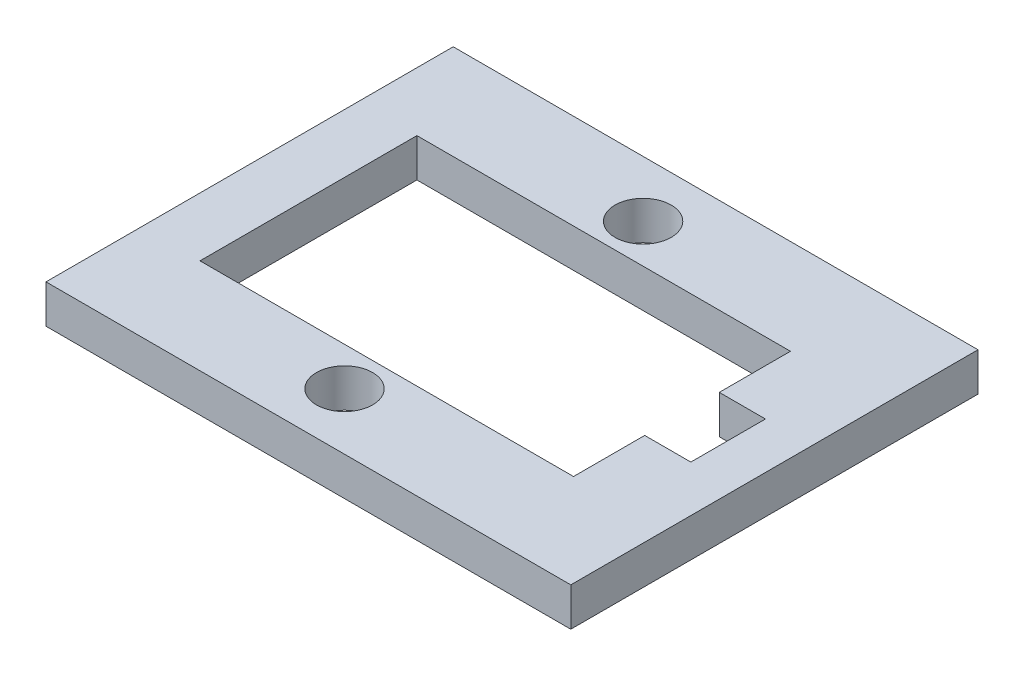
ISO-10303-21;
HEADER;
FILE_DESCRIPTION(('STEP AP214'),'2;1');
FILE_NAME('part.step','',(''),(''),'','','');
FILE_SCHEMA(('AUTOMOTIVE_DESIGN { 1 0 10303 214 1 1 1 1 }'));
ENDSEC;
DATA;
#1=APPLICATION_CONTEXT('core data for automotive mechanical design processes');
#2=APPLICATION_PROTOCOL_DEFINITION('international standard','automotive_design',2000,#1);
#3=PRODUCT_CONTEXT('',#1,'mechanical');
#4=PRODUCT('Part','Part','',(#3));
#5=PRODUCT_RELATED_PRODUCT_CATEGORY('part','',(#4));
#6=PRODUCT_DEFINITION_FORMATION('','',#4);
#7=PRODUCT_DEFINITION_CONTEXT('part definition',#1,'design');
#8=PRODUCT_DEFINITION('design','',#6,#7);
#9=PRODUCT_DEFINITION_SHAPE('','',#8);
#10=(LENGTH_UNIT() NAMED_UNIT(*) SI_UNIT(.MILLI.,.METRE.));
#11=(NAMED_UNIT(*) PLANE_ANGLE_UNIT() SI_UNIT($,.RADIAN.));
#12=(NAMED_UNIT(*) SI_UNIT($,.STERADIAN.) SOLID_ANGLE_UNIT());
#13=UNCERTAINTY_MEASURE_WITH_UNIT(LENGTH_MEASURE(1.E-05),#10,'distance_accuracy_value','');
#14=(GEOMETRIC_REPRESENTATION_CONTEXT(3) GLOBAL_UNCERTAINTY_ASSIGNED_CONTEXT((#13)) GLOBAL_UNIT_ASSIGNED_CONTEXT((#10,
#11,#12)) REPRESENTATION_CONTEXT('',''));
#15=CARTESIAN_POINT('',(0.,0.,0.));
#16=DIRECTION('',(0.,0.,1.));
#17=DIRECTION('',(1.,0.,0.));
#18=AXIS2_PLACEMENT_3D('',#15,#16,#17);
#19=CARTESIAN_POINT('',(0.,1.25,0.));
#20=DIRECTION('',(0.,1.,0.));
#21=DIRECTION('',(0.,0.,1.));
#22=AXIS2_PLACEMENT_3D('',#19,#20,#21);
#23=PLANE('',#22);
#24=CARTESIAN_POINT('',(-0.702610465116271,1.25,-10.3664818651471));
#25=DIRECTION('',(0.,1.,0.));
#26=DIRECTION('',(0.,0.,1.));
#27=AXIS2_PLACEMENT_3D('',#24,#25,#26);
#28=CIRCLE('',#27,1.825);
#29=CARTESIAN_POINT('',(-0.702610465116271,1.25,-8.54148186514709));
#30=VERTEX_POINT('',#29);
#31=EDGE_CURVE('E177',#30,#30,#28,.T.);
#32=ORIENTED_EDGE('',*,*,#31,.F.);
#33=EDGE_LOOP('',(#32));
#34=FACE_BOUND('',#33,.T.);
#35=DIRECTION('',(0.,0.,1.));
#36=VECTOR('',#35,1.);
#37=CARTESIAN_POINT('',(-16.7014916384778,1.25,-14.0165789852008));
#38=LINE('',#37,#36);
#39=CARTESIAN_POINT('',(-16.7014916384778,1.25,-14.0165789852008));
#40=VERTEX_POINT('',#39);
#41=CARTESIAN_POINT('',(-16.7014916384778,1.25,12.4615737843552));
#42=VERTEX_POINT('',#41);
#43=EDGE_CURVE('E221',#40,#42,#38,.T.);
#44=ORIENTED_EDGE('',*,*,#43,.T.);
#45=DIRECTION('',(1.,0.,0.));
#46=VECTOR('',#45,1.);
#47=CARTESIAN_POINT('',(-16.7014916384778,1.25,12.4615737843552));
#48=LINE('',#47,#46);
#49=CARTESIAN_POINT('',(17.4229383615222,1.25,12.4615737843552));
#50=VERTEX_POINT('',#49);
#51=EDGE_CURVE('E225',#42,#50,#48,.T.);
#52=ORIENTED_EDGE('',*,*,#51,.T.);
#53=DIRECTION('',(0.,0.,-1.));
#54=VECTOR('',#53,1.);
#55=CARTESIAN_POINT('',(17.4229383615222,1.25,-14.0165789852008));
#56=LINE('',#55,#54);
#57=CARTESIAN_POINT('',(17.4229383615222,1.25,-14.0165789852008));
#58=VERTEX_POINT('',#57);
#59=EDGE_CURVE('E229',#50,#58,#56,.T.);
#60=ORIENTED_EDGE('',*,*,#59,.T.);
#61=DIRECTION('',(-1.,0.,0.));
#62=VECTOR('',#61,1.);
#63=CARTESIAN_POINT('',(-16.7014916384778,1.25,-14.0165789852008));
#64=LINE('',#63,#62);
#65=EDGE_CURVE('E232',#58,#40,#64,.T.);
#66=ORIENTED_EDGE('',*,*,#65,.T.);
#67=EDGE_LOOP('',(#44,#52,#60,#66));
#68=FACE_BOUND('',#67,.T.);
#69=DIRECTION('',(1.,0.,0.));
#70=VECTOR('',#69,1.);
#71=CARTESIAN_POINT('',(11.4112391266143,1.25,6.27157377957716));
#72=LINE('',#71,#70);
#73=CARTESIAN_POINT('',(-12.8783508733857,1.25,6.27157377957716));
#74=VERTEX_POINT('',#73);
#75=CARTESIAN_POINT('',(11.4112391266143,1.25,6.27157377957716));
#76=VERTEX_POINT('',#75);
#77=EDGE_CURVE('E138',#74,#76,#72,.T.);
#78=ORIENTED_EDGE('',*,*,#77,.F.);
#79=DIRECTION('',(0.,0.,1.));
#80=VECTOR('',#79,1.);
#81=CARTESIAN_POINT('',(-12.8783508733857,1.25,6.27157377957716));
#82=LINE('',#81,#80);
#83=CARTESIAN_POINT('',(-12.8783508733857,1.25,-7.83354898042284));
#84=VERTEX_POINT('',#83);
#85=EDGE_CURVE('E129',#84,#74,#82,.T.);
#86=ORIENTED_EDGE('',*,*,#85,.F.);
#87=DIRECTION('',(-1.,0.,0.));
#88=VECTOR('',#87,1.);
#89=CARTESIAN_POINT('',(-12.8783508733857,1.25,-7.83354898042284));
#90=LINE('',#89,#88);
#91=CARTESIAN_POINT('',(11.4112391266143,1.25,-7.83354898042284));
#92=VERTEX_POINT('',#91);
#93=EDGE_CURVE('E172',#92,#84,#90,.T.);
#94=ORIENTED_EDGE('',*,*,#93,.F.);
#95=DIRECTION('',(0.,0.,-1.));
#96=VECTOR('',#95,1.);
#97=CARTESIAN_POINT('',(11.4112391266143,1.25,-7.83354898042284));
#98=LINE('',#97,#96);
#99=CARTESIAN_POINT('',(11.4112391266143,1.25,-3.20588260042284));
#100=VERTEX_POINT('',#99);
#101=EDGE_CURVE('E169',#100,#92,#98,.T.);
#102=ORIENTED_EDGE('',*,*,#101,.F.);
#103=DIRECTION('',(-1.,0.,0.));
#104=VECTOR('',#103,1.);
#105=CARTESIAN_POINT('',(11.4112391266143,1.25,-3.20588260042284));
#106=LINE('',#105,#104);
#107=CARTESIAN_POINT('',(14.4112391266143,1.25,-3.20588260042284));
#108=VERTEX_POINT('',#107);
#109=EDGE_CURVE('E166',#108,#100,#106,.T.);
#110=ORIENTED_EDGE('',*,*,#109,.F.);
#111=DIRECTION('',(0.,0.,-1.));
#112=VECTOR('',#111,1.);
#113=CARTESIAN_POINT('',(14.4112391266143,1.25,-3.20588260042284));
#114=LINE('',#113,#112);
#115=CARTESIAN_POINT('',(14.4112391266143,1.25,1.64390739957716));
#116=VERTEX_POINT('',#115);
#117=EDGE_CURVE('E163',#116,#108,#114,.T.);
#118=ORIENTED_EDGE('',*,*,#117,.F.);
#119=DIRECTION('',(1.,0.,0.));
#120=VECTOR('',#119,1.);
#121=CARTESIAN_POINT('',(14.4112391266143,1.25,1.64390739957716));
#122=LINE('',#121,#120);
#123=CARTESIAN_POINT('',(11.4112391266143,1.25,1.64390739957716));
#124=VERTEX_POINT('',#123);
#125=EDGE_CURVE('E157',#124,#116,#122,.T.);
#126=ORIENTED_EDGE('',*,*,#125,.F.);
#127=DIRECTION('',(0.,0.,-1.));
#128=VECTOR('',#127,1.);
#129=CARTESIAN_POINT('',(11.4112391266143,1.25,1.64390739957716));
#130=LINE('',#129,#128);
#131=EDGE_CURVE('E153',#76,#124,#130,.T.);
#132=ORIENTED_EDGE('',*,*,#131,.F.);
#133=EDGE_LOOP('',(#78,#86,#94,#102,#110,#118,#126,#132));
#134=FACE_BOUND('',#133,.T.);
#135=CARTESIAN_POINT('',(-0.978049999999997,1.25,8.77351813485291));
#136=DIRECTION('',(0.,1.,0.));
#137=DIRECTION('',(0.,0.,1.));
#138=AXIS2_PLACEMENT_3D('',#135,#136,#137);
#139=CIRCLE('',#138,1.825);
#140=CARTESIAN_POINT('',(-0.978049999999997,1.25,10.5985181348529));
#141=VERTEX_POINT('',#140);
#142=EDGE_CURVE('E338',#141,#141,#139,.T.);
#143=ORIENTED_EDGE('',*,*,#142,.F.);
#144=EDGE_LOOP('',(#143));
#145=FACE_BOUND('',#144,.T.);
#146=ADVANCED_FACE('F39',(#34,#68,#134,#145),#23,.T.);
#147=CARTESIAN_POINT('',(0.,-1.25,0.));
#148=DIRECTION('',(0.,1.,0.));
#149=DIRECTION('',(0.,0.,1.));
#150=AXIS2_PLACEMENT_3D('',#147,#148,#149);
#151=PLANE('',#150);
#152=DIRECTION('',(0.,0.,1.));
#153=VECTOR('',#152,1.);
#154=CARTESIAN_POINT('',(-16.7014916384778,-1.25,-14.0165789852008));
#155=LINE('',#154,#153);
#156=CARTESIAN_POINT('',(-16.7014916384778,-1.25,-14.0165789852008));
#157=VERTEX_POINT('',#156);
#158=CARTESIAN_POINT('',(-16.7014916384778,-1.25,12.4615737843552));
#159=VERTEX_POINT('',#158);
#160=EDGE_CURVE('E147',#157,#159,#155,.T.);
#161=ORIENTED_EDGE('',*,*,#160,.F.);
#162=DIRECTION('',(-1.,0.,0.));
#163=VECTOR('',#162,1.);
#164=CARTESIAN_POINT('',(-16.7014916384778,-1.25,-14.0165789852008));
#165=LINE('',#164,#163);
#166=CARTESIAN_POINT('',(17.4229383615222,-1.25,-14.0165789852008));
#167=VERTEX_POINT('',#166);
#168=EDGE_CURVE('E226',#167,#157,#165,.T.);
#169=ORIENTED_EDGE('',*,*,#168,.F.);
#170=DIRECTION('',(0.,0.,-1.));
#171=VECTOR('',#170,1.);
#172=CARTESIAN_POINT('',(17.4229383615222,-1.25,-14.0165789852008));
#173=LINE('',#172,#171);
#174=CARTESIAN_POINT('',(17.4229383615222,-1.25,12.4615737843552));
#175=VERTEX_POINT('',#174);
#176=EDGE_CURVE('E242',#175,#167,#173,.T.);
#177=ORIENTED_EDGE('',*,*,#176,.F.);
#178=DIRECTION('',(1.,0.,0.));
#179=VECTOR('',#178,1.);
#180=CARTESIAN_POINT('',(-16.7014916384778,-1.25,12.4615737843552));
#181=LINE('',#180,#179);
#182=EDGE_CURVE('E239',#159,#175,#181,.T.);
#183=ORIENTED_EDGE('',*,*,#182,.F.);
#184=EDGE_LOOP('',(#161,#169,#177,#183));
#185=FACE_BOUND('',#184,.T.);
#186=DIRECTION('',(0.,0.,1.));
#187=VECTOR('',#186,1.);
#188=CARTESIAN_POINT('',(-12.8783508733857,-1.25,6.27157377957716));
#189=LINE('',#188,#187);
#190=CARTESIAN_POINT('',(-12.8783508733857,-1.25,-7.83354898042284));
#191=VERTEX_POINT('',#190);
#192=CARTESIAN_POINT('',(-12.8783508733857,-1.25,6.27157377957716));
#193=VERTEX_POINT('',#192);
#194=EDGE_CURVE('E63',#191,#193,#189,.T.);
#195=ORIENTED_EDGE('',*,*,#194,.T.);
#196=DIRECTION('',(1.,0.,0.));
#197=VECTOR('',#196,1.);
#198=CARTESIAN_POINT('',(11.4112391266143,-1.25,6.27157377957716));
#199=LINE('',#198,#197);
#200=CARTESIAN_POINT('',(11.4112391266143,-1.25,6.27157377957716));
#201=VERTEX_POINT('',#200);
#202=EDGE_CURVE('E145',#193,#201,#199,.T.);
#203=ORIENTED_EDGE('',*,*,#202,.T.);
#204=DIRECTION('',(0.,0.,-1.));
#205=VECTOR('',#204,1.);
#206=CARTESIAN_POINT('',(11.4112391266143,-1.25,1.64390739957716));
#207=LINE('',#206,#205);
#208=CARTESIAN_POINT('',(11.4112391266143,-1.25,1.64390739957716));
#209=VERTEX_POINT('',#208);
#210=EDGE_CURVE('E180',#201,#209,#207,.T.);
#211=ORIENTED_EDGE('',*,*,#210,.T.);
#212=DIRECTION('',(1.,0.,0.));
#213=VECTOR('',#212,1.);
#214=CARTESIAN_POINT('',(14.4112391266143,-1.25,1.64390739957716));
#215=LINE('',#214,#213);
#216=CARTESIAN_POINT('',(14.4112391266143,-1.25,1.64390739957716));
#217=VERTEX_POINT('',#216);
#218=EDGE_CURVE('E184',#209,#217,#215,.T.);
#219=ORIENTED_EDGE('',*,*,#218,.T.);
#220=DIRECTION('',(0.,0.,-1.));
#221=VECTOR('',#220,1.);
#222=CARTESIAN_POINT('',(14.4112391266143,-1.25,-3.20588260042284));
#223=LINE('',#222,#221);
#224=CARTESIAN_POINT('',(14.4112391266143,-1.25,-3.20588260042284));
#225=VERTEX_POINT('',#224);
#226=EDGE_CURVE('E188',#217,#225,#223,.T.);
#227=ORIENTED_EDGE('',*,*,#226,.T.);
#228=DIRECTION('',(-1.,0.,0.));
#229=VECTOR('',#228,1.);
#230=CARTESIAN_POINT('',(11.4112391266143,-1.25,-3.20588260042284));
#231=LINE('',#230,#229);
#232=CARTESIAN_POINT('',(11.4112391266143,-1.25,-3.20588260042284));
#233=VERTEX_POINT('',#232);
#234=EDGE_CURVE('E192',#225,#233,#231,.T.);
#235=ORIENTED_EDGE('',*,*,#234,.T.);
#236=DIRECTION('',(0.,0.,-1.));
#237=VECTOR('',#236,1.);
#238=CARTESIAN_POINT('',(11.4112391266143,-1.25,-7.83354898042284));
#239=LINE('',#238,#237);
#240=CARTESIAN_POINT('',(11.4112391266143,-1.25,-7.83354898042284));
#241=VERTEX_POINT('',#240);
#242=EDGE_CURVE('E196',#233,#241,#239,.T.);
#243=ORIENTED_EDGE('',*,*,#242,.T.);
#244=DIRECTION('',(-1.,0.,0.));
#245=VECTOR('',#244,1.);
#246=CARTESIAN_POINT('',(-12.8783508733857,-1.25,-7.83354898042284));
#247=LINE('',#246,#245);
#248=EDGE_CURVE('E139',#241,#191,#247,.T.);
#249=ORIENTED_EDGE('',*,*,#248,.T.);
#250=EDGE_LOOP('',(#195,#203,#211,#219,#227,#235,#243,#249));
#251=FACE_BOUND('',#250,.T.);
#252=CARTESIAN_POINT('',(-0.702610465116271,-1.25,-10.3664818651471));
#253=DIRECTION('',(0.,1.,0.));
#254=DIRECTION('',(0.,0.,1.));
#255=AXIS2_PLACEMENT_3D('',#252,#253,#254);
#256=CIRCLE('',#255,1.825);
#257=CARTESIAN_POINT('',(-0.702610465116271,-1.25,-8.54148186514709));
#258=VERTEX_POINT('',#257);
#259=EDGE_CURVE('E346',#258,#258,#256,.T.);
#260=ORIENTED_EDGE('',*,*,#259,.T.);
#261=EDGE_LOOP('',(#260));
#262=FACE_BOUND('',#261,.T.);
#263=CARTESIAN_POINT('',(-0.978049999999997,-1.25,8.77351813485291));
#264=DIRECTION('',(0.,1.,0.));
#265=DIRECTION('',(0.,0.,1.));
#266=AXIS2_PLACEMENT_3D('',#263,#264,#265);
#267=CIRCLE('',#266,1.825);
#268=CARTESIAN_POINT('',(-0.978049999999997,-1.25,10.5985181348529));
#269=VERTEX_POINT('',#268);
#270=EDGE_CURVE('E341',#269,#269,#267,.T.);
#271=ORIENTED_EDGE('',*,*,#270,.T.);
#272=EDGE_LOOP('',(#271));
#273=FACE_BOUND('',#272,.T.);
#274=ADVANCED_FACE('F265',(#185,#251,#262,#273),#151,.F.);
#275=CARTESIAN_POINT('',(-16.7014916384778,1.25,-14.0165789852008));
#276=DIRECTION('',(1.,0.,0.));
#277=DIRECTION('',(0.,0.,-1.));
#278=AXIS2_PLACEMENT_3D('',#275,#276,#277);
#279=PLANE('',#278);
#280=ORIENTED_EDGE('',*,*,#160,.T.);
#281=DIRECTION('',(0.,-1.,0.));
#282=VECTOR('',#281,1.);
#283=CARTESIAN_POINT('',(-16.7014916384778,1.25,12.4615737843552));
#284=LINE('',#283,#282);
#285=EDGE_CURVE('E11',#42,#159,#284,.T.);
#286=ORIENTED_EDGE('',*,*,#285,.F.);
#287=ORIENTED_EDGE('',*,*,#43,.F.);
#288=DIRECTION('',(0.,-1.,0.));
#289=VECTOR('',#288,1.);
#290=CARTESIAN_POINT('',(-16.7014916384778,1.25,-14.0165789852008));
#291=LINE('',#290,#289);
#292=EDGE_CURVE('E235',#40,#157,#291,.T.);
#293=ORIENTED_EDGE('',*,*,#292,.T.);
#294=EDGE_LOOP('',(#280,#286,#287,#293));
#295=FACE_BOUND('',#294,.T.);
#296=ADVANCED_FACE('F41',(#295),#279,.F.);
#297=CARTESIAN_POINT('',(-16.7014916384778,1.25,12.4615737843552));
#298=DIRECTION('',(0.,0.,-1.));
#299=DIRECTION('',(-1.,0.,0.));
#300=AXIS2_PLACEMENT_3D('',#297,#298,#299);
#301=PLANE('',#300);
#302=ORIENTED_EDGE('',*,*,#182,.T.);
#303=DIRECTION('',(0.,-1.,0.));
#304=VECTOR('',#303,1.);
#305=CARTESIAN_POINT('',(17.4229383615222,1.25,12.4615737843552));
#306=LINE('',#305,#304);
#307=EDGE_CURVE('E48',#50,#175,#306,.T.);
#308=ORIENTED_EDGE('',*,*,#307,.F.);
#309=ORIENTED_EDGE('',*,*,#51,.F.);
#310=ORIENTED_EDGE('',*,*,#285,.T.);
#311=EDGE_LOOP('',(#302,#308,#309,#310));
#312=FACE_BOUND('',#311,.T.);
#313=ADVANCED_FACE('F275',(#312),#301,.F.);
#314=CARTESIAN_POINT('',(17.4229383615222,1.25,-14.0165789852008));
#315=DIRECTION('',(-1.,0.,0.));
#316=DIRECTION('',(0.,0.,1.));
#317=AXIS2_PLACEMENT_3D('',#314,#315,#316);
#318=PLANE('',#317);
#319=ORIENTED_EDGE('',*,*,#176,.T.);
#320=DIRECTION('',(0.,-1.,0.));
#321=VECTOR('',#320,1.);
#322=CARTESIAN_POINT('',(17.4229383615222,1.25,-14.0165789852008));
#323=LINE('',#322,#321);
#324=EDGE_CURVE('E250',#58,#167,#323,.T.);
#325=ORIENTED_EDGE('',*,*,#324,.F.);
#326=ORIENTED_EDGE('',*,*,#59,.F.);
#327=ORIENTED_EDGE('',*,*,#307,.T.);
#328=EDGE_LOOP('',(#319,#325,#326,#327));
#329=FACE_BOUND('',#328,.T.);
#330=ADVANCED_FACE('F259',(#329),#318,.F.);
#331=CARTESIAN_POINT('',(-16.7014916384778,1.25,-14.0165789852008));
#332=DIRECTION('',(0.,0.,1.));
#333=DIRECTION('',(1.,0.,0.));
#334=AXIS2_PLACEMENT_3D('',#331,#332,#333);
#335=PLANE('',#334);
#336=ORIENTED_EDGE('',*,*,#168,.T.);
#337=ORIENTED_EDGE('',*,*,#292,.F.);
#338=ORIENTED_EDGE('',*,*,#65,.F.);
#339=ORIENTED_EDGE('',*,*,#324,.T.);
#340=EDGE_LOOP('',(#336,#337,#338,#339));
#341=FACE_BOUND('',#340,.T.);
#342=ADVANCED_FACE('F269',(#341),#335,.F.);
#343=CARTESIAN_POINT('',(-12.8783508733857,1.25,6.27157377957716));
#344=DIRECTION('',(1.,0.,0.));
#345=DIRECTION('',(0.,0.,-1.));
#346=AXIS2_PLACEMENT_3D('',#343,#344,#345);
#347=PLANE('',#346);
#348=ORIENTED_EDGE('',*,*,#194,.F.);
#349=DIRECTION('',(0.,-1.,0.));
#350=VECTOR('',#349,1.);
#351=CARTESIAN_POINT('',(-12.8783508733857,1.25,-7.83354898042284));
#352=LINE('',#351,#350);
#353=EDGE_CURVE('E133',#84,#191,#352,.T.);
#354=ORIENTED_EDGE('',*,*,#353,.F.);
#355=ORIENTED_EDGE('',*,*,#85,.T.);
#356=DIRECTION('',(0.,-1.,0.));
#357=VECTOR('',#356,1.);
#358=CARTESIAN_POINT('',(-12.8783508733857,1.25,6.27157377957716));
#359=LINE('',#358,#357);
#360=EDGE_CURVE('E132',#74,#193,#359,.T.);
#361=ORIENTED_EDGE('',*,*,#360,.T.);
#362=EDGE_LOOP('',(#348,#354,#355,#361));
#363=FACE_BOUND('',#362,.T.);
#364=ADVANCED_FACE('F131',(#363),#347,.T.);
#365=CARTESIAN_POINT('',(11.4112391266143,1.25,6.27157377957716));
#366=DIRECTION('',(0.,0.,-1.));
#367=DIRECTION('',(-1.,0.,0.));
#368=AXIS2_PLACEMENT_3D('',#365,#366,#367);
#369=PLANE('',#368);
#370=ORIENTED_EDGE('',*,*,#202,.F.);
#371=ORIENTED_EDGE('',*,*,#360,.F.);
#372=ORIENTED_EDGE('',*,*,#77,.T.);
#373=DIRECTION('',(0.,-1.,0.));
#374=VECTOR('',#373,1.);
#375=CARTESIAN_POINT('',(11.4112391266143,1.25,6.27157377957716));
#376=LINE('',#375,#374);
#377=EDGE_CURVE('E148',#76,#201,#376,.T.);
#378=ORIENTED_EDGE('',*,*,#377,.T.);
#379=EDGE_LOOP('',(#370,#371,#372,#378));
#380=FACE_BOUND('',#379,.T.);
#381=ADVANCED_FACE('F142',(#380),#369,.T.);
#382=CARTESIAN_POINT('',(11.4112391266143,1.25,1.64390739957716));
#383=DIRECTION('',(-1.,0.,0.));
#384=DIRECTION('',(0.,0.,1.));
#385=AXIS2_PLACEMENT_3D('',#382,#383,#384);
#386=PLANE('',#385);
#387=ORIENTED_EDGE('',*,*,#210,.F.);
#388=ORIENTED_EDGE('',*,*,#377,.F.);
#389=ORIENTED_EDGE('',*,*,#131,.T.);
#390=DIRECTION('',(0.,-1.,0.));
#391=VECTOR('',#390,1.);
#392=CARTESIAN_POINT('',(11.4112391266143,1.25,1.64390739957716));
#393=LINE('',#392,#391);
#394=EDGE_CURVE('E216',#124,#209,#393,.T.);
#395=ORIENTED_EDGE('',*,*,#394,.T.);
#396=EDGE_LOOP('',(#387,#388,#389,#395));
#397=FACE_BOUND('',#396,.T.);
#398=ADVANCED_FACE('F300',(#397),#386,.T.);
#399=CARTESIAN_POINT('',(14.4112391266143,1.25,1.64390739957716));
#400=DIRECTION('',(0.,0.,-1.));
#401=DIRECTION('',(-1.,0.,0.));
#402=AXIS2_PLACEMENT_3D('',#399,#400,#401);
#403=PLANE('',#402);
#404=ORIENTED_EDGE('',*,*,#218,.F.);
#405=ORIENTED_EDGE('',*,*,#394,.F.);
#406=ORIENTED_EDGE('',*,*,#125,.T.);
#407=DIRECTION('',(0.,-1.,0.));
#408=VECTOR('',#407,1.);
#409=CARTESIAN_POINT('',(14.4112391266143,1.25,1.64390739957716));
#410=LINE('',#409,#408);
#411=EDGE_CURVE('E213',#116,#217,#410,.T.);
#412=ORIENTED_EDGE('',*,*,#411,.T.);
#413=EDGE_LOOP('',(#404,#405,#406,#412));
#414=FACE_BOUND('',#413,.T.);
#415=ADVANCED_FACE('F304',(#414),#403,.T.);
#416=CARTESIAN_POINT('',(14.4112391266143,1.25,-3.20588260042284));
#417=DIRECTION('',(-1.,0.,0.));
#418=DIRECTION('',(0.,0.,1.));
#419=AXIS2_PLACEMENT_3D('',#416,#417,#418);
#420=PLANE('',#419);
#421=ORIENTED_EDGE('',*,*,#226,.F.);
#422=ORIENTED_EDGE('',*,*,#411,.F.);
#423=ORIENTED_EDGE('',*,*,#117,.T.);
#424=DIRECTION('',(0.,-1.,0.));
#425=VECTOR('',#424,1.);
#426=CARTESIAN_POINT('',(14.4112391266143,1.25,-3.20588260042284));
#427=LINE('',#426,#425);
#428=EDGE_CURVE('E210',#108,#225,#427,.T.);
#429=ORIENTED_EDGE('',*,*,#428,.T.);
#430=EDGE_LOOP('',(#421,#422,#423,#429));
#431=FACE_BOUND('',#430,.T.);
#432=ADVANCED_FACE('F310',(#431),#420,.T.);
#433=CARTESIAN_POINT('',(11.4112391266143,1.25,-3.20588260042284));
#434=DIRECTION('',(0.,0.,1.));
#435=DIRECTION('',(1.,0.,0.));
#436=AXIS2_PLACEMENT_3D('',#433,#434,#435);
#437=PLANE('',#436);
#438=ORIENTED_EDGE('',*,*,#234,.F.);
#439=ORIENTED_EDGE('',*,*,#428,.F.);
#440=ORIENTED_EDGE('',*,*,#109,.T.);
#441=DIRECTION('',(0.,-1.,0.));
#442=VECTOR('',#441,1.);
#443=CARTESIAN_POINT('',(11.4112391266143,1.25,-3.20588260042284));
#444=LINE('',#443,#442);
#445=EDGE_CURVE('E207',#100,#233,#444,.T.);
#446=ORIENTED_EDGE('',*,*,#445,.T.);
#447=EDGE_LOOP('',(#438,#439,#440,#446));
#448=FACE_BOUND('',#447,.T.);
#449=ADVANCED_FACE('F314',(#448),#437,.T.);
#450=CARTESIAN_POINT('',(11.4112391266143,1.25,-7.83354898042284));
#451=DIRECTION('',(-1.,0.,0.));
#452=DIRECTION('',(0.,0.,1.));
#453=AXIS2_PLACEMENT_3D('',#450,#451,#452);
#454=PLANE('',#453);
#455=ORIENTED_EDGE('',*,*,#242,.F.);
#456=ORIENTED_EDGE('',*,*,#445,.F.);
#457=ORIENTED_EDGE('',*,*,#101,.T.);
#458=DIRECTION('',(0.,-1.,0.));
#459=VECTOR('',#458,1.);
#460=CARTESIAN_POINT('',(11.4112391266143,1.25,-7.83354898042284));
#461=LINE('',#460,#459);
#462=EDGE_CURVE('E55',#92,#241,#461,.T.);
#463=ORIENTED_EDGE('',*,*,#462,.T.);
#464=EDGE_LOOP('',(#455,#456,#457,#463));
#465=FACE_BOUND('',#464,.T.);
#466=ADVANCED_FACE('F318',(#465),#454,.T.);
#467=CARTESIAN_POINT('',(-12.8783508733857,1.25,-7.83354898042284));
#468=DIRECTION('',(0.,0.,1.));
#469=DIRECTION('',(1.,0.,0.));
#470=AXIS2_PLACEMENT_3D('',#467,#468,#469);
#471=PLANE('',#470);
#472=ORIENTED_EDGE('',*,*,#248,.F.);
#473=ORIENTED_EDGE('',*,*,#462,.F.);
#474=ORIENTED_EDGE('',*,*,#93,.T.);
#475=ORIENTED_EDGE('',*,*,#353,.T.);
#476=EDGE_LOOP('',(#472,#473,#474,#475));
#477=FACE_BOUND('',#476,.T.);
#478=ADVANCED_FACE('F322',(#477),#471,.T.);
#479=CARTESIAN_POINT('',(-0.702610465116271,1.25,-10.3664818651471));
#480=DIRECTION('',(0.,-1.,0.));
#481=DIRECTION('',(0.,0.,-1.));
#482=AXIS2_PLACEMENT_3D('',#479,#480,#481);
#483=CYLINDRICAL_SURFACE('',#482,1.825);
#484=ORIENTED_EDGE('',*,*,#31,.T.);
#485=EDGE_LOOP('',(#484));
#486=FACE_BOUND('',#485,.T.);
#487=ORIENTED_EDGE('',*,*,#259,.F.);
#488=EDGE_LOOP('',(#487));
#489=FACE_BOUND('',#488,.T.);
#490=ADVANCED_FACE('F326',(#486,#489),#483,.F.);
#491=CARTESIAN_POINT('',(-0.978049999999997,1.25,8.77351813485291));
#492=DIRECTION('',(0.,-1.,0.));
#493=DIRECTION('',(0.,0.,-1.));
#494=AXIS2_PLACEMENT_3D('',#491,#492,#493);
#495=CYLINDRICAL_SURFACE('',#494,1.825);
#496=ORIENTED_EDGE('',*,*,#142,.T.);
#497=EDGE_LOOP('',(#496));
#498=FACE_BOUND('',#497,.T.);
#499=ORIENTED_EDGE('',*,*,#270,.F.);
#500=EDGE_LOOP('',(#499));
#501=FACE_BOUND('',#500,.T.);
#502=ADVANCED_FACE('F329',(#498,#501),#495,.F.);
#503=CLOSED_SHELL('',(#146,#274,#296,#313,#330,#342,#364,#381,#398,#415,#432,#449,#466,#478,
#490,#502));
#504=MANIFOLD_SOLID_BREP('B2',#503);
#505=ADVANCED_BREP_SHAPE_REPRESENTATION('',(#18,#504),#14);
#506=SHAPE_DEFINITION_REPRESENTATION(#9,#505);
ENDSEC;
END-ISO-10303-21;
